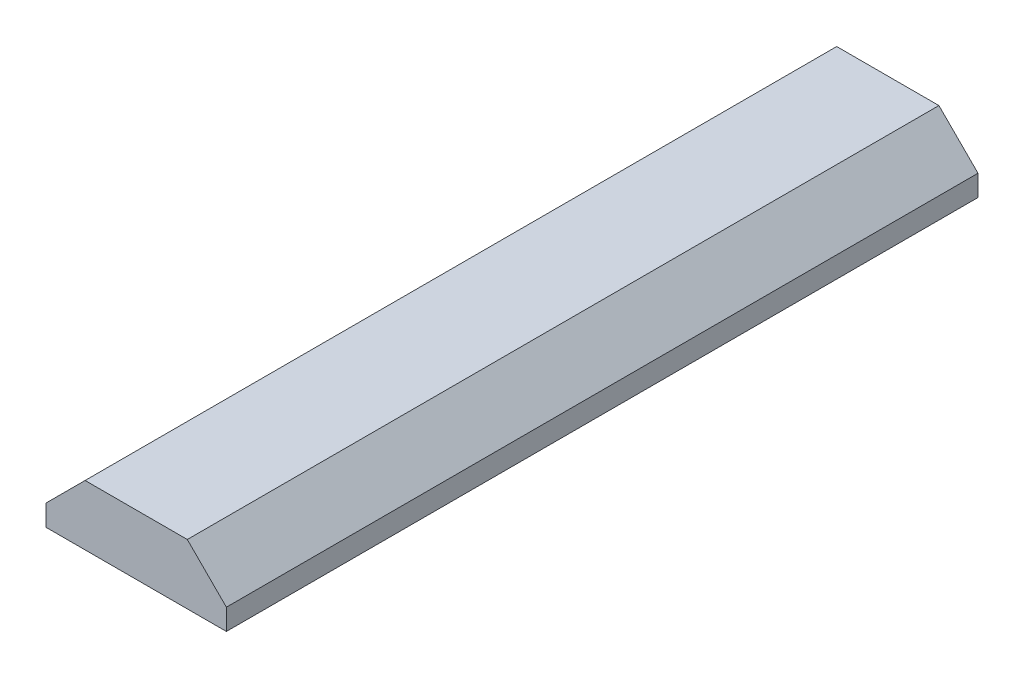
ISO-10303-21;
HEADER;
FILE_DESCRIPTION(('STEP AP214'),'2;1');
FILE_NAME('part.step','',(''),(''),'','','');
FILE_SCHEMA(('AUTOMOTIVE_DESIGN { 1 0 10303 214 1 1 1 1 }'));
ENDSEC;
DATA;
#1=APPLICATION_CONTEXT('core data for automotive mechanical design processes');
#2=APPLICATION_PROTOCOL_DEFINITION('international standard','automotive_design',2000,#1);
#3=PRODUCT_CONTEXT('',#1,'mechanical');
#4=PRODUCT('Part','Part','',(#3));
#5=PRODUCT_RELATED_PRODUCT_CATEGORY('part','',(#4));
#6=PRODUCT_DEFINITION_FORMATION('','',#4);
#7=PRODUCT_DEFINITION_CONTEXT('part definition',#1,'design');
#8=PRODUCT_DEFINITION('design','',#6,#7);
#9=PRODUCT_DEFINITION_SHAPE('','',#8);
#10=(LENGTH_UNIT() NAMED_UNIT(*) SI_UNIT(.MILLI.,.METRE.));
#11=(NAMED_UNIT(*) PLANE_ANGLE_UNIT() SI_UNIT($,.RADIAN.));
#12=(NAMED_UNIT(*) SI_UNIT($,.STERADIAN.) SOLID_ANGLE_UNIT());
#13=UNCERTAINTY_MEASURE_WITH_UNIT(LENGTH_MEASURE(1.E-05),#10,'distance_accuracy_value','');
#14=(GEOMETRIC_REPRESENTATION_CONTEXT(3) GLOBAL_UNCERTAINTY_ASSIGNED_CONTEXT((#13)) GLOBAL_UNIT_ASSIGNED_CONTEXT((#10,
#11,#12)) REPRESENTATION_CONTEXT('',''));
#15=CARTESIAN_POINT('',(0.,0.,0.));
#16=DIRECTION('',(0.,0.,1.));
#17=DIRECTION('',(1.,0.,0.));
#18=AXIS2_PLACEMENT_3D('',#15,#16,#17);
#19=CARTESIAN_POINT('',(3.4,1.80885878693797,50.));
#20=DIRECTION('',(0.707106781186549,0.707106781186546,0.));
#21=DIRECTION('',(-0.707106781186546,0.707106781186549,0.));
#22=AXIS2_PLACEMENT_3D('',#19,#20,#21);
#23=PLANE('',#22);
#24=DIRECTION('',(0.707106781186546,-0.707106781186549,0.));
#25=VECTOR('',#24,1.);
#26=CARTESIAN_POINT('',(3.4,1.80885878693797,0.));
#27=LINE('',#26,#25);
#28=CARTESIAN_POINT('',(3.4,1.80885878693797,0.));
#29=VERTEX_POINT('',#28);
#30=CARTESIAN_POINT('',(6.,-0.791141213062042,0.));
#31=VERTEX_POINT('',#30);
#32=EDGE_CURVE('E127',#29,#31,#27,.T.);
#33=ORIENTED_EDGE('',*,*,#32,.F.);
#34=DIRECTION('',(0.,0.,-1.));
#35=VECTOR('',#34,1.);
#36=CARTESIAN_POINT('',(3.4,1.80885878693797,50.));
#37=LINE('',#36,#35);
#38=CARTESIAN_POINT('',(3.4,1.80885878693797,50.));
#39=VERTEX_POINT('',#38);
#40=EDGE_CURVE('E11',#39,#29,#37,.T.);
#41=ORIENTED_EDGE('',*,*,#40,.F.);
#42=DIRECTION('',(0.707106781186546,-0.707106781186549,0.));
#43=VECTOR('',#42,1.);
#44=CARTESIAN_POINT('',(3.4,1.80885878693797,50.));
#45=LINE('',#44,#43);
#46=CARTESIAN_POINT('',(6.,-0.791141213062042,50.));
#47=VERTEX_POINT('',#46);
#48=EDGE_CURVE('E139',#39,#47,#45,.T.);
#49=ORIENTED_EDGE('',*,*,#48,.T.);
#50=DIRECTION('',(0.,0.,-1.));
#51=VECTOR('',#50,1.);
#52=CARTESIAN_POINT('',(6.,-0.791141213062042,50.));
#53=LINE('',#52,#51);
#54=EDGE_CURVE('E44',#47,#31,#53,.T.);
#55=ORIENTED_EDGE('',*,*,#54,.T.);
#56=EDGE_LOOP('',(#33,#41,#49,#55));
#57=FACE_BOUND('',#56,.T.);
#58=ADVANCED_FACE('F41',(#57),#23,.T.);
#59=CARTESIAN_POINT('',(3.4,1.80885878693797,50.));
#60=DIRECTION('',(0.,-1.,0.));
#61=DIRECTION('',(0.,0.,-1.));
#62=AXIS2_PLACEMENT_3D('',#59,#60,#61);
#63=PLANE('',#62);
#64=DIRECTION('',(-1.,0.,0.));
#65=VECTOR('',#64,1.);
#66=CARTESIAN_POINT('',(3.4,1.80885878693797,0.));
#67=LINE('',#66,#65);
#68=CARTESIAN_POINT('',(-3.4,1.80885878693797,0.));
#69=VERTEX_POINT('',#68);
#70=EDGE_CURVE('E80',#29,#69,#67,.T.);
#71=ORIENTED_EDGE('',*,*,#70,.T.);
#72=DIRECTION('',(0.,0.,-1.));
#73=VECTOR('',#72,1.);
#74=CARTESIAN_POINT('',(-3.4,1.80885878693797,50.));
#75=LINE('',#74,#73);
#76=CARTESIAN_POINT('',(-3.4,1.80885878693797,50.));
#77=VERTEX_POINT('',#76);
#78=EDGE_CURVE('E50',#77,#69,#75,.T.);
#79=ORIENTED_EDGE('',*,*,#78,.F.);
#80=DIRECTION('',(-1.,0.,0.));
#81=VECTOR('',#80,1.);
#82=CARTESIAN_POINT('',(3.4,1.80885878693797,50.));
#83=LINE('',#82,#81);
#84=EDGE_CURVE('E105',#39,#77,#83,.T.);
#85=ORIENTED_EDGE('',*,*,#84,.F.);
#86=ORIENTED_EDGE('',*,*,#40,.T.);
#87=EDGE_LOOP('',(#71,#79,#85,#86));
#88=FACE_BOUND('',#87,.T.);
#89=ADVANCED_FACE('F159',(#88),#63,.F.);
#90=CARTESIAN_POINT('',(-3.4,1.80885878693797,50.));
#91=DIRECTION('',(0.707106781186549,-0.707106781186546,0.));
#92=DIRECTION('',(0.707106781186546,0.707106781186549,0.));
#93=AXIS2_PLACEMENT_3D('',#90,#91,#92);
#94=PLANE('',#93);
#95=DIRECTION('',(-0.707106781186546,-0.707106781186549,0.));
#96=VECTOR('',#95,1.);
#97=CARTESIAN_POINT('',(-3.4,1.80885878693797,0.));
#98=LINE('',#97,#96);
#99=CARTESIAN_POINT('',(-6.,-0.791141213062042,0.));
#100=VERTEX_POINT('',#99);
#101=EDGE_CURVE('E112',#69,#100,#98,.T.);
#102=ORIENTED_EDGE('',*,*,#101,.T.);
#103=DIRECTION('',(0.,0.,-1.));
#104=VECTOR('',#103,1.);
#105=CARTESIAN_POINT('',(-6.,-0.791141213062042,50.));
#106=LINE('',#105,#104);
#107=CARTESIAN_POINT('',(-6.,-0.791141213062042,50.));
#108=VERTEX_POINT('',#107);
#109=EDGE_CURVE('E109',#108,#100,#106,.T.);
#110=ORIENTED_EDGE('',*,*,#109,.F.);
#111=DIRECTION('',(-0.707106781186546,-0.707106781186549,0.));
#112=VECTOR('',#111,1.);
#113=CARTESIAN_POINT('',(-3.4,1.80885878693797,50.));
#114=LINE('',#113,#112);
#115=EDGE_CURVE('E98',#77,#108,#114,.T.);
#116=ORIENTED_EDGE('',*,*,#115,.F.);
#117=ORIENTED_EDGE('',*,*,#78,.T.);
#118=EDGE_LOOP('',(#102,#110,#116,#117));
#119=FACE_BOUND('',#118,.T.);
#120=ADVANCED_FACE('F110',(#119),#94,.F.);
#121=CARTESIAN_POINT('',(-6.,-0.791141213062042,50.));
#122=DIRECTION('',(1.,0.,0.));
#123=DIRECTION('',(0.,0.,-1.));
#124=AXIS2_PLACEMENT_3D('',#121,#122,#123);
#125=PLANE('',#124);
#126=DIRECTION('',(0.,-1.,0.));
#127=VECTOR('',#126,1.);
#128=CARTESIAN_POINT('',(-6.,-0.791141213062042,0.));
#129=LINE('',#128,#127);
#130=CARTESIAN_POINT('',(-6.,-2.19114121306203,0.));
#131=VERTEX_POINT('',#130);
#132=EDGE_CURVE('E136',#100,#131,#129,.T.);
#133=ORIENTED_EDGE('',*,*,#132,.T.);
#134=DIRECTION('',(0.,0.,-1.));
#135=VECTOR('',#134,1.);
#136=CARTESIAN_POINT('',(-6.,-2.19114121306203,50.));
#137=LINE('',#136,#135);
#138=CARTESIAN_POINT('',(-6.,-2.19114121306203,50.));
#139=VERTEX_POINT('',#138);
#140=EDGE_CURVE('E115',#139,#131,#137,.T.);
#141=ORIENTED_EDGE('',*,*,#140,.F.);
#142=DIRECTION('',(0.,-1.,0.));
#143=VECTOR('',#142,1.);
#144=CARTESIAN_POINT('',(-6.,-0.791141213062042,50.));
#145=LINE('',#144,#143);
#146=EDGE_CURVE('E103',#108,#139,#145,.T.);
#147=ORIENTED_EDGE('',*,*,#146,.F.);
#148=ORIENTED_EDGE('',*,*,#109,.T.);
#149=EDGE_LOOP('',(#133,#141,#147,#148));
#150=FACE_BOUND('',#149,.T.);
#151=ADVANCED_FACE('F117',(#150),#125,.F.);
#152=CARTESIAN_POINT('',(-6.,-2.19114121306203,50.));
#153=DIRECTION('',(0.,1.,0.));
#154=DIRECTION('',(0.,0.,1.));
#155=AXIS2_PLACEMENT_3D('',#152,#153,#154);
#156=PLANE('',#155);
#157=DIRECTION('',(1.,0.,0.));
#158=VECTOR('',#157,1.);
#159=CARTESIAN_POINT('',(-6.,-2.19114121306203,0.));
#160=LINE('',#159,#158);
#161=CARTESIAN_POINT('',(6.,-2.19114121306203,0.));
#162=VERTEX_POINT('',#161);
#163=EDGE_CURVE('E133',#131,#162,#160,.T.);
#164=ORIENTED_EDGE('',*,*,#163,.T.);
#165=DIRECTION('',(0.,0.,-1.));
#166=VECTOR('',#165,1.);
#167=CARTESIAN_POINT('',(6.,-2.19114121306203,50.));
#168=LINE('',#167,#166);
#169=CARTESIAN_POINT('',(6.,-2.19114121306203,50.));
#170=VERTEX_POINT('',#169);
#171=EDGE_CURVE('E142',#170,#162,#168,.T.);
#172=ORIENTED_EDGE('',*,*,#171,.F.);
#173=DIRECTION('',(1.,0.,0.));
#174=VECTOR('',#173,1.);
#175=CARTESIAN_POINT('',(-6.,-2.19114121306203,50.));
#176=LINE('',#175,#174);
#177=EDGE_CURVE('E120',#139,#170,#176,.T.);
#178=ORIENTED_EDGE('',*,*,#177,.F.);
#179=ORIENTED_EDGE('',*,*,#140,.T.);
#180=EDGE_LOOP('',(#164,#172,#178,#179));
#181=FACE_BOUND('',#180,.T.);
#182=ADVANCED_FACE('F149',(#181),#156,.F.);
#183=CARTESIAN_POINT('',(6.,-0.791141213062042,50.));
#184=DIRECTION('',(1.,0.,0.));
#185=DIRECTION('',(0.,0.,-1.));
#186=AXIS2_PLACEMENT_3D('',#183,#184,#185);
#187=PLANE('',#186);
#188=DIRECTION('',(0.,-1.,0.));
#189=VECTOR('',#188,1.);
#190=CARTESIAN_POINT('',(6.,-0.791141213062042,0.));
#191=LINE('',#190,#189);
#192=EDGE_CURVE('E130',#31,#162,#191,.T.);
#193=ORIENTED_EDGE('',*,*,#192,.F.);
#194=ORIENTED_EDGE('',*,*,#54,.F.);
#195=DIRECTION('',(0.,-1.,0.));
#196=VECTOR('',#195,1.);
#197=CARTESIAN_POINT('',(6.,-0.791141213062042,50.));
#198=LINE('',#197,#196);
#199=EDGE_CURVE('E122',#47,#170,#198,.T.);
#200=ORIENTED_EDGE('',*,*,#199,.T.);
#201=ORIENTED_EDGE('',*,*,#171,.T.);
#202=EDGE_LOOP('',(#193,#194,#200,#201));
#203=FACE_BOUND('',#202,.T.);
#204=ADVANCED_FACE('F144',(#203),#187,.T.);
#205=CARTESIAN_POINT('',(0.,0.,50.));
#206=DIRECTION('',(0.,0.,-1.));
#207=DIRECTION('',(-1.,0.,0.));
#208=AXIS2_PLACEMENT_3D('',#205,#206,#207);
#209=PLANE('',#208);
#210=ORIENTED_EDGE('',*,*,#48,.F.);
#211=ORIENTED_EDGE('',*,*,#84,.T.);
#212=ORIENTED_EDGE('',*,*,#115,.T.);
#213=ORIENTED_EDGE('',*,*,#146,.T.);
#214=ORIENTED_EDGE('',*,*,#177,.T.);
#215=ORIENTED_EDGE('',*,*,#199,.F.);
#216=EDGE_LOOP('',(#210,#211,#212,#213,#214,#215));
#217=FACE_BOUND('',#216,.T.);
#218=ADVANCED_FACE('F101',(#217),#209,.F.);
#219=CARTESIAN_POINT('',(0.,0.,0.));
#220=DIRECTION('',(0.,0.,-1.));
#221=DIRECTION('',(-1.,0.,0.));
#222=AXIS2_PLACEMENT_3D('',#219,#220,#221);
#223=PLANE('',#222);
#224=ORIENTED_EDGE('',*,*,#32,.T.);
#225=ORIENTED_EDGE('',*,*,#192,.T.);
#226=ORIENTED_EDGE('',*,*,#163,.F.);
#227=ORIENTED_EDGE('',*,*,#132,.F.);
#228=ORIENTED_EDGE('',*,*,#101,.F.);
#229=ORIENTED_EDGE('',*,*,#70,.F.);
#230=EDGE_LOOP('',(#224,#225,#226,#227,#228,#229));
#231=FACE_BOUND('',#230,.T.);
#232=ADVANCED_FACE('F147',(#231),#223,.T.);
#233=CLOSED_SHELL('',(#58,#89,#120,#151,#182,#204,#218,#232));
#234=MANIFOLD_SOLID_BREP('B2',#233);
#235=ADVANCED_BREP_SHAPE_REPRESENTATION('',(#18,#234),#14);
#236=SHAPE_DEFINITION_REPRESENTATION(#9,#235);
ENDSEC;
END-ISO-10303-21;
